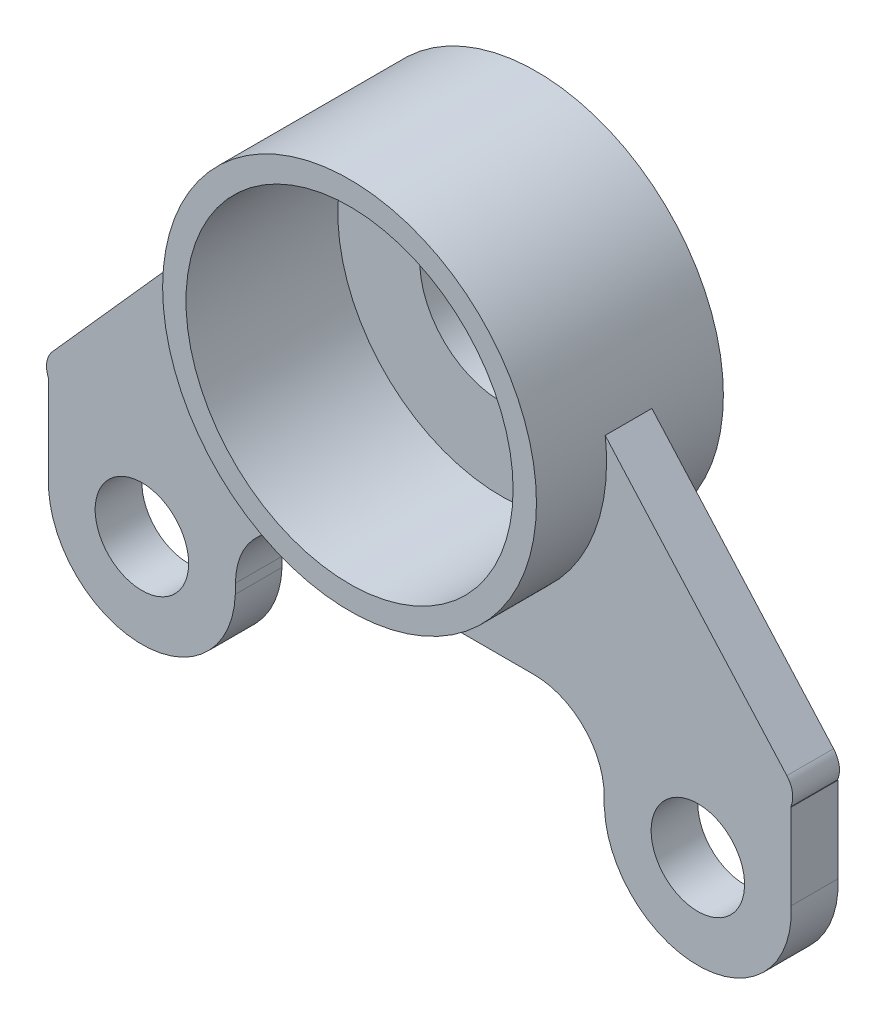
ISO-10303-21;
HEADER;
FILE_DESCRIPTION(('STEP AP214'),'2;1');
FILE_NAME('part.step','',(''),(''),'','','');
FILE_SCHEMA(('AUTOMOTIVE_DESIGN { 1 0 10303 214 1 1 1 1 }'));
ENDSEC;
DATA;
#1=APPLICATION_CONTEXT('core data for automotive mechanical design processes');
#2=APPLICATION_PROTOCOL_DEFINITION('international standard','automotive_design',2000,#1);
#3=PRODUCT_CONTEXT('',#1,'mechanical');
#4=PRODUCT('Part','Part','',(#3));
#5=PRODUCT_RELATED_PRODUCT_CATEGORY('part','',(#4));
#6=PRODUCT_DEFINITION_FORMATION('','',#4);
#7=PRODUCT_DEFINITION_CONTEXT('part definition',#1,'design');
#8=PRODUCT_DEFINITION('design','',#6,#7);
#9=PRODUCT_DEFINITION_SHAPE('','',#8);
#10=(LENGTH_UNIT() NAMED_UNIT(*) SI_UNIT(.MILLI.,.METRE.));
#11=(NAMED_UNIT(*) PLANE_ANGLE_UNIT() SI_UNIT($,.RADIAN.));
#12=(NAMED_UNIT(*) SI_UNIT($,.STERADIAN.) SOLID_ANGLE_UNIT());
#13=UNCERTAINTY_MEASURE_WITH_UNIT(LENGTH_MEASURE(1.E-05),#10,'distance_accuracy_value','');
#14=(GEOMETRIC_REPRESENTATION_CONTEXT(3) GLOBAL_UNCERTAINTY_ASSIGNED_CONTEXT((#13)) GLOBAL_UNIT_ASSIGNED_CONTEXT((#10,
#11,#12)) REPRESENTATION_CONTEXT('',''));
#15=CARTESIAN_POINT('',(0.,0.,0.));
#16=DIRECTION('',(0.,0.,1.));
#17=DIRECTION('',(1.,0.,0.));
#18=AXIS2_PLACEMENT_3D('',#15,#16,#17);
#19=CARTESIAN_POINT('',(41.481618266519,-6.81808244946121,4.));
#20=DIRECTION('',(1.,0.,0.));
#21=DIRECTION('',(0.,0.,-1.));
#22=AXIS2_PLACEMENT_3D('',#19,#20,#21);
#23=PLANE('',#22);
#24=DIRECTION('',(0.,-1.,0.));
#25=VECTOR('',#24,1.);
#26=CARTESIAN_POINT('',(41.481618266519,-6.81808244946121,4.));
#27=LINE('',#26,#25);
#28=CARTESIAN_POINT('',(41.481618266519,1.18191755053879,4.));
#29=VERTEX_POINT('',#28);
#30=CARTESIAN_POINT('',(41.481618266519,-6.13439152434948,4.));
#31=VERTEX_POINT('',#30);
#32=EDGE_CURVE('E200',#29,#31,#27,.T.);
#33=ORIENTED_EDGE('',*,*,#32,.T.);
#34=DIRECTION('',(0.,0.,1.));
#35=VECTOR('',#34,1.);
#36=CARTESIAN_POINT('',(41.481618266519,-6.13439152434948,0.));
#37=LINE('',#36,#35);
#38=CARTESIAN_POINT('',(41.481618266519,-6.13439152434948,0.));
#39=VERTEX_POINT('',#38);
#40=EDGE_CURVE('E195',#31,#39,#37,.F.);
#41=ORIENTED_EDGE('',*,*,#40,.T.);
#42=DIRECTION('',(0.,-1.,0.));
#43=VECTOR('',#42,1.);
#44=CARTESIAN_POINT('',(41.481618266519,-6.81808244946121,0.));
#45=LINE('',#44,#43);
#46=CARTESIAN_POINT('',(41.481618266519,1.18191755053879,0.));
#47=VERTEX_POINT('',#46);
#48=EDGE_CURVE('E199',#47,#39,#45,.T.);
#49=ORIENTED_EDGE('',*,*,#48,.F.);
#50=DIRECTION('',(0.,0.,-1.));
#51=VECTOR('',#50,1.);
#52=CARTESIAN_POINT('',(41.481618266519,1.18191755053879,4.));
#53=LINE('',#52,#51);
#54=EDGE_CURVE('E221',#29,#47,#53,.T.);
#55=ORIENTED_EDGE('',*,*,#54,.F.);
#56=EDGE_LOOP('',(#33,#41,#49,#55));
#57=FACE_BOUND('',#56,.T.);
#58=ADVANCED_FACE('F36',(#57),#23,.T.);
#59=CARTESIAN_POINT('',(25.481618266519,-6.81808244946121,4.));
#60=DIRECTION('',(0.,-1.,0.));
#61=DIRECTION('',(1.,0.,0.));
#62=AXIS2_PLACEMENT_3D('',#59,#60,#61);
#63=PLANE('',#62);
#64=DIRECTION('',(-1.,0.,0.));
#65=VECTOR('',#64,1.);
#66=CARTESIAN_POINT('',(25.481618266519,-6.81808244946121,0.));
#67=LINE('',#66,#65);
#68=CARTESIAN_POINT('',(25.4968850994738,-6.81808244946121,0.));
#69=VERTEX_POINT('',#68);
#70=CARTESIAN_POINT('',(25.481618266519,-6.81808244946121,0.));
#71=VERTEX_POINT('',#70);
#72=EDGE_CURVE('E203',#69,#71,#67,.T.);
#73=ORIENTED_EDGE('',*,*,#72,.F.);
#74=DIRECTION('',(0.,0.,1.));
#75=VECTOR('',#74,1.);
#76=CARTESIAN_POINT('',(25.4968850994738,-6.81808244946121,0.));
#77=LINE('',#76,#75);
#78=CARTESIAN_POINT('',(25.4968850994738,-6.81808244946121,4.));
#79=VERTEX_POINT('',#78);
#80=EDGE_CURVE('E296',#69,#79,#77,.T.);
#81=ORIENTED_EDGE('',*,*,#80,.T.);
#82=DIRECTION('',(-1.,0.,0.));
#83=VECTOR('',#82,1.);
#84=CARTESIAN_POINT('',(25.481618266519,-6.81808244946121,4.));
#85=LINE('',#84,#83);
#86=CARTESIAN_POINT('',(25.481618266519,-6.81808244946121,4.));
#87=VERTEX_POINT('',#86);
#88=EDGE_CURVE('E208',#79,#87,#85,.T.);
#89=ORIENTED_EDGE('',*,*,#88,.T.);
#90=DIRECTION('',(0.,0.,-1.));
#91=VECTOR('',#90,1.);
#92=CARTESIAN_POINT('',(25.481618266519,-6.81808244946121,4.));
#93=LINE('',#92,#91);
#94=EDGE_CURVE('E210',#87,#71,#93,.T.);
#95=ORIENTED_EDGE('',*,*,#94,.T.);
#96=EDGE_LOOP('',(#73,#81,#89,#95));
#97=FACE_BOUND('',#96,.T.);
#98=ADVANCED_FACE('F324',(#97),#63,.T.);
#99=CARTESIAN_POINT('',(-24.718317204901,0.,4.));
#100=DIRECTION('',(0.,1.,0.));
#101=DIRECTION('',(0.,0.,1.));
#102=AXIS2_PLACEMENT_3D('',#99,#100,#101);
#103=PLANE('',#102);
#104=DIRECTION('',(1.,0.,0.));
#105=VECTOR('',#104,1.);
#106=CARTESIAN_POINT('',(-24.718317204901,0.,0.));
#107=LINE('',#106,#105);
#108=CARTESIAN_POINT('',(-0.0816182665190172,0.,0.));
#109=VERTEX_POINT('',#108);
#110=CARTESIAN_POINT('',(19.481618266519,0.,0.));
#111=VERTEX_POINT('',#110);
#112=EDGE_CURVE('E167',#109,#111,#107,.T.);
#113=ORIENTED_EDGE('',*,*,#112,.T.);
#114=DIRECTION('',(0.,0.,1.));
#115=VECTOR('',#114,1.);
#116=CARTESIAN_POINT('',(19.481618266519,0.,4.));
#117=LINE('',#116,#115);
#118=CARTESIAN_POINT('',(19.481618266519,0.,4.));
#119=VERTEX_POINT('',#118);
#120=EDGE_CURVE('E299',#111,#119,#117,.T.);
#121=ORIENTED_EDGE('',*,*,#120,.T.);
#122=DIRECTION('',(1.,0.,0.));
#123=VECTOR('',#122,1.);
#124=CARTESIAN_POINT('',(-24.718317204901,0.,4.));
#125=LINE('',#124,#123);
#126=CARTESIAN_POINT('',(-0.0816182665190172,0.,4.));
#127=VERTEX_POINT('',#126);
#128=EDGE_CURVE('E259',#127,#119,#125,.T.);
#129=ORIENTED_EDGE('',*,*,#128,.F.);
#130=DIRECTION('',(0.,0.,1.));
#131=VECTOR('',#130,1.);
#132=CARTESIAN_POINT('',(-0.081618266519019,0.,0.));
#133=LINE('',#132,#131);
#134=EDGE_CURVE('E288',#127,#109,#133,.F.);
#135=ORIENTED_EDGE('',*,*,#134,.T.);
#136=EDGE_LOOP('',(#113,#121,#129,#135));
#137=FACE_BOUND('',#136,.T.);
#138=ADVANCED_FACE('F314',(#137),#103,.F.);
#139=CARTESIAN_POINT('',(-20.2565864569651,2.,4.));
#140=DIRECTION('',(0.,0.,-1.));
#141=DIRECTION('',(-1.,0.,0.));
#142=AXIS2_PLACEMENT_3D('',#139,#140,#141);
#143=CYLINDRICAL_SURFACE('',#142,2.);
#144=CARTESIAN_POINT('',(-20.2565864569651,2.,0.));
#145=DIRECTION('',(0.,0.,-1.));
#146=DIRECTION('',(-1.,0.,0.));
#147=AXIS2_PLACEMENT_3D('',#144,#145,#146);
#148=CIRCLE('',#147,2.);
#149=CARTESIAN_POINT('',(-22.081618266519,1.18191755053879,0.));
#150=VERTEX_POINT('',#149);
#151=CARTESIAN_POINT('',(-21.7496129500696,3.33074110588354,0.));
#152=VERTEX_POINT('',#151);
#153=EDGE_CURVE('E163',#150,#152,#148,.T.);
#154=ORIENTED_EDGE('',*,*,#153,.F.);
#155=DIRECTION('',(0.,0.,-1.));
#156=VECTOR('',#155,1.);
#157=CARTESIAN_POINT('',(-22.081618266519,1.18191755053879,4.));
#158=LINE('',#157,#156);
#159=CARTESIAN_POINT('',(-22.081618266519,1.18191755053879,4.));
#160=VERTEX_POINT('',#159);
#161=EDGE_CURVE('E247',#160,#150,#158,.T.);
#162=ORIENTED_EDGE('',*,*,#161,.F.);
#163=CARTESIAN_POINT('',(-20.2565864569651,2.,4.));
#164=DIRECTION('',(0.,0.,-1.));
#165=DIRECTION('',(-1.,0.,0.));
#166=AXIS2_PLACEMENT_3D('',#163,#164,#165);
#167=CIRCLE('',#166,2.);
#168=CARTESIAN_POINT('',(-21.7496129500696,3.33074110588354,4.));
#169=VERTEX_POINT('',#168);
#170=EDGE_CURVE('E276',#169,#160,#167,.F.);
#171=ORIENTED_EDGE('',*,*,#170,.F.);
#172=DIRECTION('',(0.,0.,-1.));
#173=VECTOR('',#172,1.);
#174=CARTESIAN_POINT('',(-21.7496129500696,3.33074110588354,4.));
#175=LINE('',#174,#173);
#176=EDGE_CURVE('E272',#152,#169,#175,.F.);
#177=ORIENTED_EDGE('',*,*,#176,.F.);
#178=EDGE_LOOP('',(#154,#162,#171,#177));
#179=FACE_BOUND('',#178,.T.);
#180=ADVANCED_FACE('F352',(#179),#143,.T.);
#181=CARTESIAN_POINT('',(-24.718317204901,0.,4.));
#182=DIRECTION('',(0.746513246552237,-0.665370552941771,0.));
#183=DIRECTION('',(0.665370552941771,0.746513246552237,0.));
#184=AXIS2_PLACEMENT_3D('',#181,#182,#183);
#185=PLANE('',#184);
#186=DIRECTION('',(-0.665370552941771,-0.746513246552237,0.));
#187=VECTOR('',#186,1.);
#188=CARTESIAN_POINT('',(-24.718317204901,0.,4.));
#189=LINE('',#188,#187);
#190=CARTESIAN_POINT('',(-6.19925390133447,20.7774840782016,4.));
#191=VERTEX_POINT('',#190);
#192=EDGE_CURVE('E173',#191,#169,#189,.T.);
#193=ORIENTED_EDGE('',*,*,#192,.F.);
#194=DIRECTION('',(0.,0.,1.));
#195=VECTOR('',#194,1.);
#196=CARTESIAN_POINT('',(-6.19925390133447,20.7774840782016,-6.));
#197=LINE('',#196,#195);
#198=CARTESIAN_POINT('',(-6.19925390133447,20.7774840782016,0.));
#199=VERTEX_POINT('',#198);
#200=EDGE_CURVE('E171',#191,#199,#197,.F.);
#201=ORIENTED_EDGE('',*,*,#200,.T.);
#202=DIRECTION('',(-0.665370552941771,-0.746513246552237,0.));
#203=VECTOR('',#202,1.);
#204=CARTESIAN_POINT('',(-24.718317204901,0.,0.));
#205=LINE('',#204,#203);
#206=EDGE_CURVE('E157',#199,#152,#205,.T.);
#207=ORIENTED_EDGE('',*,*,#206,.T.);
#208=ORIENTED_EDGE('',*,*,#176,.T.);
#209=EDGE_LOOP('',(#193,#201,#207,#208));
#210=FACE_BOUND('',#209,.T.);
#211=ADVANCED_FACE('F172',(#210),#185,.F.);
#212=CARTESIAN_POINT('',(9.68072200830674,38.5940410614726,4.));
#213=DIRECTION('',(-0.746513246552237,-0.665370552941771,0.));
#214=DIRECTION('',(0.665370552941771,-0.746513246552237,0.));
#215=AXIS2_PLACEMENT_3D('',#212,#213,#214);
#216=PLANE('',#215);
#217=DIRECTION('',(-0.665370552941771,0.746513246552237,0.));
#218=VECTOR('',#217,1.);
#219=CARTESIAN_POINT('',(9.68072200830674,38.5940410614726,0.));
#220=LINE('',#219,#218);
#221=CARTESIAN_POINT('',(41.1110569666831,3.33074110588354,0.));
#222=VERTEX_POINT('',#221);
#223=CARTESIAN_POINT('',(25.5606979179479,20.7774840782016,0.));
#224=VERTEX_POINT('',#223);
#225=EDGE_CURVE('E260',#222,#224,#220,.T.);
#226=ORIENTED_EDGE('',*,*,#225,.T.);
#227=DIRECTION('',(0.,0.,1.));
#228=VECTOR('',#227,1.);
#229=CARTESIAN_POINT('',(25.5606979179479,20.7774840782016,-6.));
#230=LINE('',#229,#228);
#231=CARTESIAN_POINT('',(25.5606979179479,20.7774840782016,4.));
#232=VERTEX_POINT('',#231);
#233=EDGE_CURVE('E60',#224,#232,#230,.T.);
#234=ORIENTED_EDGE('',*,*,#233,.T.);
#235=DIRECTION('',(-0.665370552941771,0.746513246552237,0.));
#236=VECTOR('',#235,1.);
#237=CARTESIAN_POINT('',(9.68072200830674,38.5940410614726,4.));
#238=LINE('',#237,#236);
#239=CARTESIAN_POINT('',(41.1110569666831,3.33074110588354,4.));
#240=VERTEX_POINT('',#239);
#241=EDGE_CURVE('E263',#240,#232,#238,.T.);
#242=ORIENTED_EDGE('',*,*,#241,.F.);
#243=DIRECTION('',(0.,0.,-1.));
#244=VECTOR('',#243,1.);
#245=CARTESIAN_POINT('',(41.1110569666831,3.33074110588356,4.));
#246=LINE('',#245,#244);
#247=EDGE_CURVE('E279',#240,#222,#246,.T.);
#248=ORIENTED_EDGE('',*,*,#247,.T.);
#249=EDGE_LOOP('',(#226,#234,#242,#248));
#250=FACE_BOUND('',#249,.T.);
#251=ADVANCED_FACE('F343',(#250),#216,.F.);
#252=CARTESIAN_POINT('',(0.,0.,4.));
#253=DIRECTION('',(0.,0.,-1.));
#254=DIRECTION('',(-1.,0.,0.));
#255=AXIS2_PLACEMENT_3D('',#252,#253,#254);
#256=PLANE('',#255);
#257=CARTESIAN_POINT('',(33.4923385126825,-6.5484072425761,4.));
#258=DIRECTION('',(0.,0.,-1.));
#259=DIRECTION('',(-1.,0.,0.));
#260=AXIS2_PLACEMENT_3D('',#257,#258,#259);
#261=CIRCLE('',#260,4.);
#262=CARTESIAN_POINT('',(29.4923385126825,-6.5484072425761,4.));
#263=VERTEX_POINT('',#262);
#264=EDGE_CURVE('E185',#263,#263,#261,.T.);
#265=ORIENTED_EDGE('',*,*,#264,.T.);
#266=EDGE_LOOP('',(#265));
#267=FACE_BOUND('',#266,.T.);
#268=ORIENTED_EDGE('',*,*,#241,.T.);
#269=CARTESIAN_POINT('',(9.68072200830673,18.8213743907824,4.));
#270=DIRECTION('',(0.,0.,-1.));
#271=DIRECTION('',(-1.,0.,0.));
#272=AXIS2_PLACEMENT_3D('',#269,#270,#271);
#273=CIRCLE('',#272,16.);
#274=EDGE_CURVE('E52',#232,#191,#273,.T.);
#275=ORIENTED_EDGE('',*,*,#274,.T.);
#276=ORIENTED_EDGE('',*,*,#192,.T.);
#277=ORIENTED_EDGE('',*,*,#170,.T.);
#278=DIRECTION('',(0.,-1.,0.));
#279=VECTOR('',#278,1.);
#280=CARTESIAN_POINT('',(-22.081618266519,-6.81808244946121,4.));
#281=LINE('',#280,#279);
#282=CARTESIAN_POINT('',(-22.081618266519,-6.13439152434961,4.));
#283=VERTEX_POINT('',#282);
#284=EDGE_CURVE('E238',#160,#283,#281,.T.);
#285=ORIENTED_EDGE('',*,*,#284,.T.);
#286=CARTESIAN_POINT('',(-14.0923385126825,-6.5484072425761,4.));
#287=DIRECTION('',(0.,0.,1.));
#288=DIRECTION('',(1.,0.,0.));
#289=AXIS2_PLACEMENT_3D('',#286,#287,#288);
#290=CIRCLE('',#289,8.);
#291=CARTESIAN_POINT('',(-6.09688509947379,-6.81808244946121,4.));
#292=VERTEX_POINT('',#291);
#293=EDGE_CURVE('E228',#283,#292,#290,.T.);
#294=ORIENTED_EDGE('',*,*,#293,.T.);
#295=DIRECTION('',(1.,0.,0.));
#296=VECTOR('',#295,1.);
#297=CARTESIAN_POINT('',(-6.08161826651902,-6.81808244946121,4.));
#298=LINE('',#297,#296);
#299=CARTESIAN_POINT('',(-6.08161826651902,-6.81808244946121,4.));
#300=VERTEX_POINT('',#299);
#301=EDGE_CURVE('E241',#292,#300,#298,.T.);
#302=ORIENTED_EDGE('',*,*,#301,.T.);
#303=DIRECTION('',(0.,1.,0.));
#304=VECTOR('',#303,1.);
#305=CARTESIAN_POINT('',(-6.08161826651902,1.18191755053879,4.));
#306=LINE('',#305,#304);
#307=CARTESIAN_POINT('',(-6.08161826651902,-6.,4.));
#308=VERTEX_POINT('',#307);
#309=EDGE_CURVE('E244',#300,#308,#306,.T.);
#310=ORIENTED_EDGE('',*,*,#309,.T.);
#311=CARTESIAN_POINT('',(-0.081618266519019,-6.,4.));
#312=DIRECTION('',(0.,0.,-1.));
#313=DIRECTION('',(-1.,0.,0.));
#314=AXIS2_PLACEMENT_3D('',#311,#312,#313);
#315=CIRCLE('',#314,6.);
#316=EDGE_CURVE('E290',#308,#127,#315,.T.);
#317=ORIENTED_EDGE('',*,*,#316,.T.);
#318=ORIENTED_EDGE('',*,*,#128,.T.);
#319=CARTESIAN_POINT('',(19.481618266519,-6.,4.));
#320=DIRECTION('',(0.,0.,-1.));
#321=DIRECTION('',(-1.,0.,0.));
#322=AXIS2_PLACEMENT_3D('',#319,#320,#321);
#323=CIRCLE('',#322,6.);
#324=CARTESIAN_POINT('',(25.481618266519,-6.,4.));
#325=VERTEX_POINT('',#324);
#326=EDGE_CURVE('E304',#119,#325,#323,.T.);
#327=ORIENTED_EDGE('',*,*,#326,.T.);
#328=DIRECTION('',(0.,1.,0.));
#329=VECTOR('',#328,1.);
#330=CARTESIAN_POINT('',(25.481618266519,1.18191755053879,4.));
#331=LINE('',#330,#329);
#332=EDGE_CURVE('E205',#87,#325,#331,.T.);
#333=ORIENTED_EDGE('',*,*,#332,.F.);
#334=ORIENTED_EDGE('',*,*,#88,.F.);
#335=CARTESIAN_POINT('',(33.4923385126825,-6.5484072425761,4.));
#336=DIRECTION('',(0.,0.,-1.));
#337=DIRECTION('',(-1.,0.,0.));
#338=AXIS2_PLACEMENT_3D('',#335,#336,#337);
#339=CIRCLE('',#338,8.);
#340=EDGE_CURVE('E189',#31,#79,#339,.T.);
#341=ORIENTED_EDGE('',*,*,#340,.F.);
#342=ORIENTED_EDGE('',*,*,#32,.F.);
#343=DIRECTION('',(1.,0.,0.));
#344=VECTOR('',#343,1.);
#345=CARTESIAN_POINT('',(41.481618266519,1.18191755053879,4.));
#346=LINE('',#345,#344);
#347=CARTESIAN_POINT('',(41.4430622831325,1.18191755053879,4.));
#348=VERTEX_POINT('',#347);
#349=EDGE_CURVE('E202',#348,#29,#346,.T.);
#350=ORIENTED_EDGE('',*,*,#349,.F.);
#351=CARTESIAN_POINT('',(39.6180304735786,2.,4.));
#352=DIRECTION('',(0.,0.,-1.));
#353=DIRECTION('',(-1.,0.,0.));
#354=AXIS2_PLACEMENT_3D('',#351,#352,#353);
#355=CIRCLE('',#354,2.);
#356=EDGE_CURVE('E274',#348,#240,#355,.F.);
#357=ORIENTED_EDGE('',*,*,#356,.T.);
#358=EDGE_LOOP('',(#268,#275,#276,#277,#285,#294,#302,#310,#317,#318,#327,#333,#334,#341,#342,
#350,#357));
#359=FACE_BOUND('',#358,.T.);
#360=CARTESIAN_POINT('',(-14.0923385126825,-6.5484072425761,4.));
#361=DIRECTION('',(0.,0.,1.));
#362=DIRECTION('',(1.,0.,0.));
#363=AXIS2_PLACEMENT_3D('',#360,#361,#362);
#364=CIRCLE('',#363,4.);
#365=CARTESIAN_POINT('',(-10.0923385126825,-6.5484072425761,4.));
#366=VERTEX_POINT('',#365);
#367=EDGE_CURVE('E224',#366,#366,#364,.T.);
#368=ORIENTED_EDGE('',*,*,#367,.F.);
#369=EDGE_LOOP('',(#368));
#370=FACE_BOUND('',#369,.T.);
#371=ADVANCED_FACE('F318',(#267,#359,#370),#256,.F.);
#372=CARTESIAN_POINT('',(0.,0.,0.));
#373=DIRECTION('',(0.,0.,-1.));
#374=DIRECTION('',(-1.,0.,0.));
#375=AXIS2_PLACEMENT_3D('',#372,#373,#374);
#376=PLANE('',#375);
#377=CARTESIAN_POINT('',(9.68072200830673,18.8213743907824,0.));
#378=DIRECTION('',(0.,0.,-1.));
#379=DIRECTION('',(-1.,0.,0.));
#380=AXIS2_PLACEMENT_3D('',#377,#378,#379);
#381=CIRCLE('',#380,16.);
#382=EDGE_CURVE('E11',#224,#199,#381,.T.);
#383=ORIENTED_EDGE('',*,*,#382,.F.);
#384=ORIENTED_EDGE('',*,*,#225,.F.);
#385=CARTESIAN_POINT('',(39.6180304735786,2.,0.));
#386=DIRECTION('',(0.,0.,-1.));
#387=DIRECTION('',(-1.,0.,0.));
#388=AXIS2_PLACEMENT_3D('',#385,#386,#387);
#389=CIRCLE('',#388,2.);
#390=CARTESIAN_POINT('',(41.4430622831325,1.18191755053879,0.));
#391=VERTEX_POINT('',#390);
#392=EDGE_CURVE('E264',#222,#391,#389,.T.);
#393=ORIENTED_EDGE('',*,*,#392,.T.);
#394=DIRECTION('',(1.,0.,0.));
#395=VECTOR('',#394,1.);
#396=CARTESIAN_POINT('',(41.481618266519,1.18191755053879,0.));
#397=LINE('',#396,#395);
#398=EDGE_CURVE('E213',#391,#47,#397,.T.);
#399=ORIENTED_EDGE('',*,*,#398,.T.);
#400=ORIENTED_EDGE('',*,*,#48,.T.);
#401=CARTESIAN_POINT('',(33.4923385126825,-6.5484072425761,0.));
#402=DIRECTION('',(0.,0.,-1.));
#403=DIRECTION('',(-1.,0.,0.));
#404=AXIS2_PLACEMENT_3D('',#401,#402,#403);
#405=CIRCLE('',#404,8.);
#406=EDGE_CURVE('E192',#39,#69,#405,.T.);
#407=ORIENTED_EDGE('',*,*,#406,.T.);
#408=ORIENTED_EDGE('',*,*,#72,.T.);
#409=DIRECTION('',(0.,1.,0.));
#410=VECTOR('',#409,1.);
#411=CARTESIAN_POINT('',(25.481618266519,1.18191755053879,0.));
#412=LINE('',#411,#410);
#413=CARTESIAN_POINT('',(25.481618266519,-6.,0.));
#414=VERTEX_POINT('',#413);
#415=EDGE_CURVE('E215',#71,#414,#412,.T.);
#416=ORIENTED_EDGE('',*,*,#415,.T.);
#417=CARTESIAN_POINT('',(19.481618266519,-6.,0.));
#418=DIRECTION('',(0.,0.,-1.));
#419=DIRECTION('',(-1.,0.,0.));
#420=AXIS2_PLACEMENT_3D('',#417,#418,#419);
#421=CIRCLE('',#420,6.);
#422=EDGE_CURVE('E45',#414,#111,#421,.F.);
#423=ORIENTED_EDGE('',*,*,#422,.T.);
#424=ORIENTED_EDGE('',*,*,#112,.F.);
#425=CARTESIAN_POINT('',(-0.081618266519019,-6.,0.));
#426=DIRECTION('',(0.,0.,-1.));
#427=DIRECTION('',(-1.,0.,0.));
#428=AXIS2_PLACEMENT_3D('',#425,#426,#427);
#429=CIRCLE('',#428,6.);
#430=CARTESIAN_POINT('',(-6.08161826651902,-6.,0.));
#431=VERTEX_POINT('',#430);
#432=EDGE_CURVE('E292',#109,#431,#429,.F.);
#433=ORIENTED_EDGE('',*,*,#432,.T.);
#434=DIRECTION('',(0.,1.,0.));
#435=VECTOR('',#434,1.);
#436=CARTESIAN_POINT('',(-6.08161826651902,1.18191755053879,0.));
#437=LINE('',#436,#435);
#438=CARTESIAN_POINT('',(-6.08161826651902,-6.81808244946121,0.));
#439=VERTEX_POINT('',#438);
#440=EDGE_CURVE('E242',#439,#431,#437,.T.);
#441=ORIENTED_EDGE('',*,*,#440,.F.);
#442=DIRECTION('',(1.,0.,0.));
#443=VECTOR('',#442,1.);
#444=CARTESIAN_POINT('',(-6.08161826651902,-6.81808244946121,0.));
#445=LINE('',#444,#443);
#446=CARTESIAN_POINT('',(-6.09688509947379,-6.81808244946121,0.));
#447=VERTEX_POINT('',#446);
#448=EDGE_CURVE('E250',#447,#439,#445,.T.);
#449=ORIENTED_EDGE('',*,*,#448,.F.);
#450=CARTESIAN_POINT('',(-14.0923385126825,-6.5484072425761,0.));
#451=DIRECTION('',(0.,0.,1.));
#452=DIRECTION('',(1.,0.,0.));
#453=AXIS2_PLACEMENT_3D('',#450,#451,#452);
#454=CIRCLE('',#453,8.);
#455=CARTESIAN_POINT('',(-22.081618266519,-6.13439152434961,0.));
#456=VERTEX_POINT('',#455);
#457=EDGE_CURVE('E231',#456,#447,#454,.T.);
#458=ORIENTED_EDGE('',*,*,#457,.F.);
#459=DIRECTION('',(0.,-1.,0.));
#460=VECTOR('',#459,1.);
#461=CARTESIAN_POINT('',(-22.081618266519,-6.81808244946121,0.));
#462=LINE('',#461,#460);
#463=EDGE_CURVE('E237',#150,#456,#462,.T.);
#464=ORIENTED_EDGE('',*,*,#463,.F.);
#465=ORIENTED_EDGE('',*,*,#153,.T.);
#466=ORIENTED_EDGE('',*,*,#206,.F.);
#467=EDGE_LOOP('',(#383,#384,#393,#399,#400,#407,#408,#416,#423,#424,#433,#441,#449,#458,#464,
#465,#466));
#468=FACE_BOUND('',#467,.T.);
#469=CARTESIAN_POINT('',(33.4923385126825,-6.5484072425761,0.));
#470=DIRECTION('',(0.,0.,-1.));
#471=DIRECTION('',(-1.,0.,0.));
#472=AXIS2_PLACEMENT_3D('',#469,#470,#471);
#473=CIRCLE('',#472,4.);
#474=CARTESIAN_POINT('',(29.4923385126825,-6.5484072425761,0.));
#475=VERTEX_POINT('',#474);
#476=EDGE_CURVE('E186',#475,#475,#473,.T.);
#477=ORIENTED_EDGE('',*,*,#476,.F.);
#478=EDGE_LOOP('',(#477));
#479=FACE_BOUND('',#478,.T.);
#480=CARTESIAN_POINT('',(-14.0923385126825,-6.5484072425761,0.));
#481=DIRECTION('',(0.,0.,1.));
#482=DIRECTION('',(1.,0.,0.));
#483=AXIS2_PLACEMENT_3D('',#480,#481,#482);
#484=CIRCLE('',#483,4.);
#485=CARTESIAN_POINT('',(-10.0923385126825,-6.5484072425761,0.));
#486=VERTEX_POINT('',#485);
#487=EDGE_CURVE('E225',#486,#486,#484,.T.);
#488=ORIENTED_EDGE('',*,*,#487,.T.);
#489=EDGE_LOOP('',(#488));
#490=FACE_BOUND('',#489,.T.);
#491=ADVANCED_FACE('F159',(#468,#479,#490),#376,.T.);
#492=CARTESIAN_POINT('',(39.6180304735786,2.,4.));
#493=DIRECTION('',(0.,0.,-1.));
#494=DIRECTION('',(-1.,0.,0.));
#495=AXIS2_PLACEMENT_3D('',#492,#493,#494);
#496=CYLINDRICAL_SURFACE('',#495,2.);
#497=DIRECTION('',(0.,0.,-1.));
#498=VECTOR('',#497,1.);
#499=CARTESIAN_POINT('',(41.4430622831325,1.18191755053879,4.));
#500=LINE('',#499,#498);
#501=EDGE_CURVE('E294',#391,#348,#500,.F.);
#502=ORIENTED_EDGE('',*,*,#501,.F.);
#503=ORIENTED_EDGE('',*,*,#392,.F.);
#504=ORIENTED_EDGE('',*,*,#247,.F.);
#505=ORIENTED_EDGE('',*,*,#356,.F.);
#506=EDGE_LOOP('',(#502,#503,#504,#505));
#507=FACE_BOUND('',#506,.T.);
#508=ADVANCED_FACE('F342',(#507),#496,.T.);
#509=CARTESIAN_POINT('',(-6.08161826651902,1.18191755053879,4.));
#510=DIRECTION('',(-1.,0.,0.));
#511=DIRECTION('',(0.,0.,1.));
#512=AXIS2_PLACEMENT_3D('',#509,#510,#511);
#513=PLANE('',#512);
#514=ORIENTED_EDGE('',*,*,#440,.T.);
#515=DIRECTION('',(0.,0.,1.));
#516=VECTOR('',#515,1.);
#517=CARTESIAN_POINT('',(-6.08161826651902,-6.,4.));
#518=LINE('',#517,#516);
#519=EDGE_CURVE('E285',#431,#308,#518,.T.);
#520=ORIENTED_EDGE('',*,*,#519,.T.);
#521=ORIENTED_EDGE('',*,*,#309,.F.);
#522=DIRECTION('',(0.,0.,-1.));
#523=VECTOR('',#522,1.);
#524=CARTESIAN_POINT('',(-6.08161826651902,-6.81808244946121,4.));
#525=LINE('',#524,#523);
#526=EDGE_CURVE('E168',#300,#439,#525,.T.);
#527=ORIENTED_EDGE('',*,*,#526,.T.);
#528=EDGE_LOOP('',(#514,#520,#521,#527));
#529=FACE_BOUND('',#528,.T.);
#530=ADVANCED_FACE('F375',(#529),#513,.F.);
#531=CARTESIAN_POINT('',(-22.081618266519,-6.81808244946121,4.));
#532=DIRECTION('',(1.,0.,0.));
#533=DIRECTION('',(0.,0.,-1.));
#534=AXIS2_PLACEMENT_3D('',#531,#532,#533);
#535=PLANE('',#534);
#536=ORIENTED_EDGE('',*,*,#463,.T.);
#537=DIRECTION('',(0.,0.,1.));
#538=VECTOR('',#537,1.);
#539=CARTESIAN_POINT('',(-22.081618266519,-6.13439152434961,0.));
#540=LINE('',#539,#538);
#541=EDGE_CURVE('E233',#456,#283,#540,.T.);
#542=ORIENTED_EDGE('',*,*,#541,.T.);
#543=ORIENTED_EDGE('',*,*,#284,.F.);
#544=ORIENTED_EDGE('',*,*,#161,.T.);
#545=EDGE_LOOP('',(#536,#542,#543,#544));
#546=FACE_BOUND('',#545,.T.);
#547=ADVANCED_FACE('F378',(#546),#535,.F.);
#548=CARTESIAN_POINT('',(-6.08161826651902,-6.81808244946121,4.));
#549=DIRECTION('',(0.,1.,0.));
#550=DIRECTION('',(-1.,0.,0.));
#551=AXIS2_PLACEMENT_3D('',#548,#549,#550);
#552=PLANE('',#551);
#553=ORIENTED_EDGE('',*,*,#301,.F.);
#554=DIRECTION('',(0.,0.,1.));
#555=VECTOR('',#554,1.);
#556=CARTESIAN_POINT('',(-6.09688509947379,-6.81808244946121,0.));
#557=LINE('',#556,#555);
#558=EDGE_CURVE('E282',#292,#447,#557,.F.);
#559=ORIENTED_EDGE('',*,*,#558,.T.);
#560=ORIENTED_EDGE('',*,*,#448,.T.);
#561=ORIENTED_EDGE('',*,*,#526,.F.);
#562=EDGE_LOOP('',(#553,#559,#560,#561));
#563=FACE_BOUND('',#562,.T.);
#564=ADVANCED_FACE('F373',(#563),#552,.F.);
#565=CARTESIAN_POINT('',(-14.0923385126825,-6.5484072425761,0.));
#566=DIRECTION('',(0.,0.,1.));
#567=DIRECTION('',(1.,0.,0.));
#568=AXIS2_PLACEMENT_3D('',#565,#566,#567);
#569=CYLINDRICAL_SURFACE('',#568,8.);
#570=ORIENTED_EDGE('',*,*,#541,.F.);
#571=ORIENTED_EDGE('',*,*,#457,.T.);
#572=ORIENTED_EDGE('',*,*,#558,.F.);
#573=ORIENTED_EDGE('',*,*,#293,.F.);
#574=EDGE_LOOP('',(#570,#571,#572,#573));
#575=FACE_BOUND('',#574,.T.);
#576=ADVANCED_FACE('F370',(#575),#569,.T.);
#577=CARTESIAN_POINT('',(-0.081618266519019,-6.,4.));
#578=DIRECTION('',(0.,0.,-1.));
#579=DIRECTION('',(-1.,0.,0.));
#580=AXIS2_PLACEMENT_3D('',#577,#578,#579);
#581=CYLINDRICAL_SURFACE('',#580,6.);
#582=ORIENTED_EDGE('',*,*,#432,.F.);
#583=ORIENTED_EDGE('',*,*,#134,.F.);
#584=ORIENTED_EDGE('',*,*,#316,.F.);
#585=ORIENTED_EDGE('',*,*,#519,.F.);
#586=EDGE_LOOP('',(#582,#583,#584,#585));
#587=FACE_BOUND('',#586,.T.);
#588=ADVANCED_FACE('F368',(#587),#581,.F.);
#589=CARTESIAN_POINT('',(-14.0923385126825,-6.5484072425761,0.));
#590=DIRECTION('',(0.,0.,1.));
#591=DIRECTION('',(1.,0.,0.));
#592=AXIS2_PLACEMENT_3D('',#589,#590,#591);
#593=CYLINDRICAL_SURFACE('',#592,4.);
#594=ORIENTED_EDGE('',*,*,#487,.F.);
#595=EDGE_LOOP('',(#594));
#596=FACE_BOUND('',#595,.T.);
#597=ORIENTED_EDGE('',*,*,#367,.T.);
#598=EDGE_LOOP('',(#597));
#599=FACE_BOUND('',#598,.T.);
#600=ADVANCED_FACE('F365',(#596,#599),#593,.F.);
#601=CARTESIAN_POINT('',(25.481618266519,1.18191755053879,4.));
#602=DIRECTION('',(-1.,0.,0.));
#603=DIRECTION('',(0.,0.,1.));
#604=AXIS2_PLACEMENT_3D('',#601,#602,#603);
#605=PLANE('',#604);
#606=ORIENTED_EDGE('',*,*,#332,.T.);
#607=DIRECTION('',(0.,0.,1.));
#608=VECTOR('',#607,1.);
#609=CARTESIAN_POINT('',(25.481618266519,-6.,4.));
#610=LINE('',#609,#608);
#611=EDGE_CURVE('E302',#325,#414,#610,.F.);
#612=ORIENTED_EDGE('',*,*,#611,.T.);
#613=ORIENTED_EDGE('',*,*,#415,.F.);
#614=ORIENTED_EDGE('',*,*,#94,.F.);
#615=EDGE_LOOP('',(#606,#612,#613,#614));
#616=FACE_BOUND('',#615,.T.);
#617=ADVANCED_FACE('F322',(#616),#605,.T.);
#618=CARTESIAN_POINT('',(41.481618266519,1.18191755053879,4.));
#619=DIRECTION('',(0.,1.,0.));
#620=DIRECTION('',(0.,0.,1.));
#621=AXIS2_PLACEMENT_3D('',#618,#619,#620);
#622=PLANE('',#621);
#623=ORIENTED_EDGE('',*,*,#398,.F.);
#624=ORIENTED_EDGE('',*,*,#501,.T.);
#625=ORIENTED_EDGE('',*,*,#349,.T.);
#626=ORIENTED_EDGE('',*,*,#54,.T.);
#627=EDGE_LOOP('',(#623,#624,#625,#626));
#628=FACE_BOUND('',#627,.T.);
#629=ADVANCED_FACE('F338',(#628),#622,.T.);
#630=CARTESIAN_POINT('',(33.4923385126825,-6.5484072425761,0.));
#631=DIRECTION('',(0.,0.,1.));
#632=DIRECTION('',(1.,0.,0.));
#633=AXIS2_PLACEMENT_3D('',#630,#631,#632);
#634=CYLINDRICAL_SURFACE('',#633,8.);
#635=ORIENTED_EDGE('',*,*,#40,.F.);
#636=ORIENTED_EDGE('',*,*,#340,.T.);
#637=ORIENTED_EDGE('',*,*,#80,.F.);
#638=ORIENTED_EDGE('',*,*,#406,.F.);
#639=EDGE_LOOP('',(#635,#636,#637,#638));
#640=FACE_BOUND('',#639,.T.);
#641=ADVANCED_FACE('F331',(#640),#634,.T.);
#642=CARTESIAN_POINT('',(19.481618266519,-6.,4.));
#643=DIRECTION('',(0.,0.,1.));
#644=DIRECTION('',(1.,0.,0.));
#645=AXIS2_PLACEMENT_3D('',#642,#643,#644);
#646=CYLINDRICAL_SURFACE('',#645,6.);
#647=ORIENTED_EDGE('',*,*,#422,.F.);
#648=ORIENTED_EDGE('',*,*,#611,.F.);
#649=ORIENTED_EDGE('',*,*,#326,.F.);
#650=ORIENTED_EDGE('',*,*,#120,.F.);
#651=EDGE_LOOP('',(#647,#648,#649,#650));
#652=FACE_BOUND('',#651,.T.);
#653=ADVANCED_FACE('F38',(#652),#646,.F.);
#654=CARTESIAN_POINT('',(33.4923385126825,-6.5484072425761,0.));
#655=DIRECTION('',(0.,0.,1.));
#656=DIRECTION('',(1.,0.,0.));
#657=AXIS2_PLACEMENT_3D('',#654,#655,#656);
#658=CYLINDRICAL_SURFACE('',#657,4.);
#659=ORIENTED_EDGE('',*,*,#476,.T.);
#660=EDGE_LOOP('',(#659));
#661=FACE_BOUND('',#660,.T.);
#662=ORIENTED_EDGE('',*,*,#264,.F.);
#663=EDGE_LOOP('',(#662));
#664=FACE_BOUND('',#663,.T.);
#665=ADVANCED_FACE('F524',(#661,#664),#658,.F.);
#666=CARTESIAN_POINT('',(9.68072200830673,18.8213743907824,-6.));
#667=DIRECTION('',(0.,0.,1.));
#668=DIRECTION('',(1.,0.,0.));
#669=AXIS2_PLACEMENT_3D('',#666,#667,#668);
#670=CYLINDRICAL_SURFACE('',#669,16.);
#671=CARTESIAN_POINT('',(9.68072200830673,18.8213743907824,10.));
#672=DIRECTION('',(0.,0.,1.));
#673=DIRECTION('',(1.,0.,0.));
#674=AXIS2_PLACEMENT_3D('',#671,#672,#673);
#675=CIRCLE('',#674,16.);
#676=CARTESIAN_POINT('',(25.6807220083067,18.8213743907824,10.));
#677=VERTEX_POINT('',#676);
#678=EDGE_CURVE('E180',#677,#677,#675,.T.);
#679=ORIENTED_EDGE('',*,*,#678,.F.);
#680=EDGE_LOOP('',(#679));
#681=FACE_BOUND('',#680,.T.);
#682=CARTESIAN_POINT('',(9.68072200830673,18.8213743907824,-6.));
#683=DIRECTION('',(0.,0.,1.));
#684=DIRECTION('',(1.,0.,0.));
#685=AXIS2_PLACEMENT_3D('',#682,#683,#684);
#686=CIRCLE('',#685,16.);
#687=CARTESIAN_POINT('',(25.6807220083067,18.8213743907824,-6.));
#688=VERTEX_POINT('',#687);
#689=EDGE_CURVE('E177',#688,#688,#686,.T.);
#690=ORIENTED_EDGE('',*,*,#689,.T.);
#691=EDGE_LOOP('',(#690));
#692=FACE_BOUND('',#691,.T.);
#693=ORIENTED_EDGE('',*,*,#274,.F.);
#694=ORIENTED_EDGE('',*,*,#233,.F.);
#695=ORIENTED_EDGE('',*,*,#382,.T.);
#696=ORIENTED_EDGE('',*,*,#200,.F.);
#697=EDGE_LOOP('',(#693,#694,#695,#696));
#698=FACE_BOUND('',#697,.T.);
#699=ADVANCED_FACE('F176',(#681,#692,#698),#670,.T.);
#700=CARTESIAN_POINT('',(9.68072200830673,18.8213743907824,-6.));
#701=DIRECTION('',(0.,0.,1.));
#702=DIRECTION('',(1.,0.,0.));
#703=AXIS2_PLACEMENT_3D('',#700,#701,#702);
#704=PLANE('',#703);
#705=CARTESIAN_POINT('',(9.68072200830673,18.8213743907824,-6.));
#706=DIRECTION('',(0.,0.,1.));
#707=DIRECTION('',(1.,0.,0.));
#708=AXIS2_PLACEMENT_3D('',#705,#706,#707);
#709=CIRCLE('',#708,7.);
#710=CARTESIAN_POINT('',(16.6807220083067,18.8213743907824,-6.));
#711=VERTEX_POINT('',#710);
#712=EDGE_CURVE('E40',#711,#711,#709,.T.);
#713=ORIENTED_EDGE('',*,*,#712,.T.);
#714=EDGE_LOOP('',(#713));
#715=FACE_BOUND('',#714,.T.);
#716=ORIENTED_EDGE('',*,*,#689,.F.);
#717=EDGE_LOOP('',(#716));
#718=FACE_BOUND('',#717,.T.);
#719=ADVANCED_FACE('F556',(#715,#718),#704,.F.);
#720=CARTESIAN_POINT('',(9.68072200830673,18.8213743907824,10.));
#721=DIRECTION('',(0.,0.,1.));
#722=DIRECTION('',(1.,0.,0.));
#723=AXIS2_PLACEMENT_3D('',#720,#721,#722);
#724=PLANE('',#723);
#725=CARTESIAN_POINT('',(9.68072200830673,18.8213743907824,10.));
#726=DIRECTION('',(0.,0.,1.));
#727=DIRECTION('',(1.,0.,0.));
#728=AXIS2_PLACEMENT_3D('',#725,#726,#727);
#729=CIRCLE('',#728,14.);
#730=CARTESIAN_POINT('',(23.6807220083067,18.8213743907824,10.));
#731=VERTEX_POINT('',#730);
#732=EDGE_CURVE('E616',#731,#731,#729,.T.);
#733=ORIENTED_EDGE('',*,*,#732,.F.);
#734=EDGE_LOOP('',(#733));
#735=FACE_BOUND('',#734,.T.);
#736=ORIENTED_EDGE('',*,*,#678,.T.);
#737=EDGE_LOOP('',(#736));
#738=FACE_BOUND('',#737,.T.);
#739=ADVANCED_FACE('F564',(#735,#738),#724,.T.);
#740=CARTESIAN_POINT('',(9.68072200830673,18.8213743907824,-3.));
#741=DIRECTION('',(0.,0.,1.));
#742=DIRECTION('',(1.,0.,0.));
#743=AXIS2_PLACEMENT_3D('',#740,#741,#742);
#744=CYLINDRICAL_SURFACE('',#743,14.);
#745=CARTESIAN_POINT('',(9.68072200830673,18.8213743907824,-3.));
#746=DIRECTION('',(0.,0.,1.));
#747=DIRECTION('',(1.,0.,0.));
#748=AXIS2_PLACEMENT_3D('',#745,#746,#747);
#749=CIRCLE('',#748,14.);
#750=CARTESIAN_POINT('',(23.6807220083067,18.8213743907824,-3.));
#751=VERTEX_POINT('',#750);
#752=EDGE_CURVE('E618',#751,#751,#749,.T.);
#753=CARTESIAN_POINT('',(23.6807220083067,18.8213743907824,-3.));
#754=CARTESIAN_POINT('',(23.6807220083067,18.8213743907824,-2.86458333333333));
#755=CARTESIAN_POINT('',(23.6807220083067,18.8213743907824,-2.72916666666667));
#756=CARTESIAN_POINT('',(23.6807220083067,18.8213743907824,-2.45833333333333));
#757=CARTESIAN_POINT('',(23.6807220083067,18.8213743907824,-2.32291666666667));
#758=CARTESIAN_POINT('',(23.6807220083067,18.8213743907824,-2.05208333333333));
#759=CARTESIAN_POINT('',(23.6807220083067,18.8213743907824,-1.91666666666667));
#760=CARTESIAN_POINT('',(23.6807220083067,18.8213743907824,-1.64583333333333));
#761=CARTESIAN_POINT('',(23.6807220083067,18.8213743907824,-1.51041666666667));
#762=CARTESIAN_POINT('',(23.6807220083067,18.8213743907824,-1.23958333333333));
#763=CARTESIAN_POINT('',(23.6807220083067,18.8213743907824,-1.10416666666667));
#764=CARTESIAN_POINT('',(23.6807220083067,18.8213743907824,-0.833333333333333));
#765=CARTESIAN_POINT('',(23.6807220083067,18.8213743907824,-0.697916666666666));
#766=CARTESIAN_POINT('',(23.6807220083067,18.8213743907824,-0.427083333333333));
#767=CARTESIAN_POINT('',(23.6807220083067,18.8213743907824,-0.291666666666666));
#768=CARTESIAN_POINT('',(23.6807220083067,18.8213743907824,-0.0208333333333331));
#769=CARTESIAN_POINT('',(23.6807220083067,18.8213743907824,0.114583333333334));
#770=CARTESIAN_POINT('',(23.6807220083067,18.8213743907824,0.385416666666667));
#771=CARTESIAN_POINT('',(23.6807220083067,18.8213743907824,0.520833333333334));
#772=CARTESIAN_POINT('',(23.6807220083067,18.8213743907824,0.791666666666667));
#773=CARTESIAN_POINT('',(23.6807220083067,18.8213743907824,0.927083333333333));
#774=CARTESIAN_POINT('',(23.6807220083067,18.8213743907824,1.19791666666667));
#775=CARTESIAN_POINT('',(23.6807220083067,18.8213743907824,1.33333333333333));
#776=CARTESIAN_POINT('',(23.6807220083067,18.8213743907824,1.60416666666667));
#777=CARTESIAN_POINT('',(23.6807220083067,18.8213743907824,1.73958333333333));
#778=CARTESIAN_POINT('',(23.6807220083067,18.8213743907824,2.01041666666667));
#779=CARTESIAN_POINT('',(23.6807220083067,18.8213743907824,2.14583333333333));
#780=CARTESIAN_POINT('',(23.6807220083067,18.8213743907824,2.41666666666667));
#781=CARTESIAN_POINT('',(23.6807220083067,18.8213743907824,2.55208333333333));
#782=CARTESIAN_POINT('',(23.6807220083067,18.8213743907824,2.82291666666667));
#783=CARTESIAN_POINT('',(23.6807220083067,18.8213743907824,2.95833333333333));
#784=CARTESIAN_POINT('',(23.6807220083067,18.8213743907824,3.22916666666667));
#785=CARTESIAN_POINT('',(23.6807220083067,18.8213743907824,3.36458333333333));
#786=CARTESIAN_POINT('',(23.6807220083067,18.8213743907824,3.63541666666667));
#787=CARTESIAN_POINT('',(23.6807220083067,18.8213743907824,3.77083333333333));
#788=CARTESIAN_POINT('',(23.6807220083067,18.8213743907824,4.04166666666667));
#789=CARTESIAN_POINT('',(23.6807220083067,18.8213743907824,4.17708333333333));
#790=CARTESIAN_POINT('',(23.6807220083067,18.8213743907824,4.44791666666667));
#791=CARTESIAN_POINT('',(23.6807220083067,18.8213743907824,4.58333333333333));
#792=CARTESIAN_POINT('',(23.6807220083067,18.8213743907824,4.85416666666667));
#793=CARTESIAN_POINT('',(23.6807220083067,18.8213743907824,4.98958333333333));
#794=CARTESIAN_POINT('',(23.6807220083067,18.8213743907824,5.26041666666667));
#795=CARTESIAN_POINT('',(23.6807220083067,18.8213743907824,5.39583333333333));
#796=CARTESIAN_POINT('',(23.6807220083067,18.8213743907824,5.66666666666667));
#797=CARTESIAN_POINT('',(23.6807220083067,18.8213743907824,5.80208333333333));
#798=CARTESIAN_POINT('',(23.6807220083067,18.8213743907824,6.07291666666667));
#799=CARTESIAN_POINT('',(23.6807220083067,18.8213743907824,6.20833333333333));
#800=CARTESIAN_POINT('',(23.6807220083067,18.8213743907824,6.47916666666667));
#801=CARTESIAN_POINT('',(23.6807220083067,18.8213743907824,6.61458333333333));
#802=CARTESIAN_POINT('',(23.6807220083067,18.8213743907824,6.88541666666667));
#803=CARTESIAN_POINT('',(23.6807220083067,18.8213743907824,7.02083333333333));
#804=CARTESIAN_POINT('',(23.6807220083067,18.8213743907824,7.29166666666667));
#805=CARTESIAN_POINT('',(23.6807220083067,18.8213743907824,7.42708333333333));
#806=CARTESIAN_POINT('',(23.6807220083067,18.8213743907824,7.69791666666667));
#807=CARTESIAN_POINT('',(23.6807220083067,18.8213743907824,7.83333333333333));
#808=CARTESIAN_POINT('',(23.6807220083067,18.8213743907824,8.10416666666667));
#809=CARTESIAN_POINT('',(23.6807220083067,18.8213743907824,8.23958333333333));
#810=CARTESIAN_POINT('',(23.6807220083067,18.8213743907824,8.51041666666667));
#811=CARTESIAN_POINT('',(23.6807220083067,18.8213743907824,8.64583333333333));
#812=CARTESIAN_POINT('',(23.6807220083067,18.8213743907824,8.91666666666667));
#813=CARTESIAN_POINT('',(23.6807220083067,18.8213743907824,9.05208333333333));
#814=CARTESIAN_POINT('',(23.6807220083067,18.8213743907824,9.32291666666667));
#815=CARTESIAN_POINT('',(23.6807220083067,18.8213743907824,9.45833333333333));
#816=CARTESIAN_POINT('',(23.6807220083067,18.8213743907824,9.72916666666667));
#817=CARTESIAN_POINT('',(23.6807220083067,18.8213743907824,9.86458333333333));
#818=CARTESIAN_POINT('',(23.6807220083067,18.8213743907824,10.));
#819=B_SPLINE_CURVE_WITH_KNOTS('',3,(#753,#754,#755,#756,#757,#758,#759,#760,#761,#762,#763,
#764,#765,#766,#767,#768,#769,#770,#771,#772,#773,#774,#775,#776,#777,#778,#779,#780,#781,#782,
#783,#784,#785,#786,#787,#788,#789,#790,#791,#792,#793,#794,#795,#796,#797,#798,#799,#800,#801,
#802,#803,#804,#805,#806,#807,#808,#809,#810,#811,#812,#813,#814,#815,#816,#817,#818),
.UNSPECIFIED.,.F.,.F.,(4,2,2,2,2,2,2,2,2,2,2,2,2,2,2,2,2,2,2,2,2,2,2,2,2,2,2,2,2,2,2,2,4),(0.,
0.40625,0.8125,1.21875,1.625,2.03125,2.4375,2.84375,3.25,3.65625,4.0625,4.46875,4.875,5.28125,
5.6875,6.09375,6.5,6.90625,7.3125,7.71875,8.125,8.53125,8.9375,9.34375,9.75,10.15625,10.5625,
10.96875,11.375,11.78125,12.1875,12.59375,13.),.UNSPECIFIED.);
#820=EDGE_CURVE('BSEAM569',#751,#731,#819,.T.);
#821=ORIENTED_EDGE('',*,*,#752,.F.);
#822=ORIENTED_EDGE('',*,*,#732,.T.);
#823=ORIENTED_EDGE('',*,*,#820,.T.);
#824=ORIENTED_EDGE('',*,*,#820,.F.);
#825=EDGE_LOOP('',(#821,#823,#822,#824));
#826=FACE_BOUND('',#825,.T.);
#827=ADVANCED_FACE('F569',(#826),#744,.F.);
#828=CARTESIAN_POINT('',(9.68072200830673,18.8213743907824,-3.));
#829=DIRECTION('',(0.,0.,1.));
#830=DIRECTION('',(1.,0.,0.));
#831=AXIS2_PLACEMENT_3D('',#828,#829,#830);
#832=PLANE('',#831);
#833=CARTESIAN_POINT('',(9.68072200830673,18.8213743907824,-3.));
#834=DIRECTION('',(0.,0.,1.));
#835=DIRECTION('',(1.,0.,0.));
#836=AXIS2_PLACEMENT_3D('',#833,#834,#835);
#837=CIRCLE('',#836,7.);
#838=CARTESIAN_POINT('',(16.6807220083067,18.8213743907824,-3.));
#839=VERTEX_POINT('',#838);
#840=EDGE_CURVE('E613',#839,#839,#837,.T.);
#841=ORIENTED_EDGE('',*,*,#840,.F.);
#842=EDGE_LOOP('',(#841));
#843=FACE_BOUND('',#842,.T.);
#844=ORIENTED_EDGE('',*,*,#752,.T.);
#845=EDGE_LOOP('',(#844));
#846=FACE_BOUND('',#845,.T.);
#847=ADVANCED_FACE('F579',(#843,#846),#832,.T.);
#848=CARTESIAN_POINT('',(9.68072200830673,18.8213743907824,-16.));
#849=DIRECTION('',(0.,0.,1.));
#850=DIRECTION('',(1.,0.,0.));
#851=AXIS2_PLACEMENT_3D('',#848,#849,#850);
#852=CYLINDRICAL_SURFACE('',#851,7.);
#853=CARTESIAN_POINT('',(16.6807220083067,18.8213743907824,-3.));
#854=CARTESIAN_POINT('',(16.6807220083067,18.8213743907824,-3.03125));
#855=CARTESIAN_POINT('',(16.6807220083067,18.8213743907824,-3.0625));
#856=CARTESIAN_POINT('',(16.6807220083067,18.8213743907824,-3.125));
#857=CARTESIAN_POINT('',(16.6807220083067,18.8213743907824,-3.15625));
#858=CARTESIAN_POINT('',(16.6807220083067,18.8213743907824,-3.21875));
#859=CARTESIAN_POINT('',(16.6807220083067,18.8213743907824,-3.25));
#860=CARTESIAN_POINT('',(16.6807220083067,18.8213743907824,-3.3125));
#861=CARTESIAN_POINT('',(16.6807220083067,18.8213743907824,-3.34375));
#862=CARTESIAN_POINT('',(16.6807220083067,18.8213743907824,-3.40625));
#863=CARTESIAN_POINT('',(16.6807220083067,18.8213743907824,-3.4375));
#864=CARTESIAN_POINT('',(16.6807220083067,18.8213743907824,-3.5));
#865=CARTESIAN_POINT('',(16.6807220083067,18.8213743907824,-3.53125));
#866=CARTESIAN_POINT('',(16.6807220083067,18.8213743907824,-3.59375));
#867=CARTESIAN_POINT('',(16.6807220083067,18.8213743907824,-3.625));
#868=CARTESIAN_POINT('',(16.6807220083067,18.8213743907824,-3.6875));
#869=CARTESIAN_POINT('',(16.6807220083067,18.8213743907824,-3.71875));
#870=CARTESIAN_POINT('',(16.6807220083067,18.8213743907824,-3.78125));
#871=CARTESIAN_POINT('',(16.6807220083067,18.8213743907824,-3.8125));
#872=CARTESIAN_POINT('',(16.6807220083067,18.8213743907824,-3.875));
#873=CARTESIAN_POINT('',(16.6807220083067,18.8213743907824,-3.90625));
#874=CARTESIAN_POINT('',(16.6807220083067,18.8213743907824,-3.96875));
#875=CARTESIAN_POINT('',(16.6807220083067,18.8213743907824,-4.));
#876=CARTESIAN_POINT('',(16.6807220083067,18.8213743907824,-4.0625));
#877=CARTESIAN_POINT('',(16.6807220083067,18.8213743907824,-4.09375));
#878=CARTESIAN_POINT('',(16.6807220083067,18.8213743907824,-4.15625));
#879=CARTESIAN_POINT('',(16.6807220083067,18.8213743907824,-4.1875));
#880=CARTESIAN_POINT('',(16.6807220083067,18.8213743907824,-4.25));
#881=CARTESIAN_POINT('',(16.6807220083067,18.8213743907824,-4.28125));
#882=CARTESIAN_POINT('',(16.6807220083067,18.8213743907824,-4.34375));
#883=CARTESIAN_POINT('',(16.6807220083067,18.8213743907824,-4.375));
#884=CARTESIAN_POINT('',(16.6807220083067,18.8213743907824,-4.4375));
#885=CARTESIAN_POINT('',(16.6807220083067,18.8213743907824,-4.46875));
#886=CARTESIAN_POINT('',(16.6807220083067,18.8213743907824,-4.53125));
#887=CARTESIAN_POINT('',(16.6807220083067,18.8213743907824,-4.5625));
#888=CARTESIAN_POINT('',(16.6807220083067,18.8213743907824,-4.625));
#889=CARTESIAN_POINT('',(16.6807220083067,18.8213743907824,-4.65625));
#890=CARTESIAN_POINT('',(16.6807220083067,18.8213743907824,-4.71875));
#891=CARTESIAN_POINT('',(16.6807220083067,18.8213743907824,-4.75));
#892=CARTESIAN_POINT('',(16.6807220083067,18.8213743907824,-4.8125));
#893=CARTESIAN_POINT('',(16.6807220083067,18.8213743907824,-4.84375));
#894=CARTESIAN_POINT('',(16.6807220083067,18.8213743907824,-4.90625));
#895=CARTESIAN_POINT('',(16.6807220083067,18.8213743907824,-4.9375));
#896=CARTESIAN_POINT('',(16.6807220083067,18.8213743907824,-5.));
#897=CARTESIAN_POINT('',(16.6807220083067,18.8213743907824,-5.03125));
#898=CARTESIAN_POINT('',(16.6807220083067,18.8213743907824,-5.09375));
#899=CARTESIAN_POINT('',(16.6807220083067,18.8213743907824,-5.125));
#900=CARTESIAN_POINT('',(16.6807220083067,18.8213743907824,-5.1875));
#901=CARTESIAN_POINT('',(16.6807220083067,18.8213743907824,-5.21875));
#902=CARTESIAN_POINT('',(16.6807220083067,18.8213743907824,-5.28125));
#903=CARTESIAN_POINT('',(16.6807220083067,18.8213743907824,-5.3125));
#904=CARTESIAN_POINT('',(16.6807220083067,18.8213743907824,-5.375));
#905=CARTESIAN_POINT('',(16.6807220083067,18.8213743907824,-5.40625));
#906=CARTESIAN_POINT('',(16.6807220083067,18.8213743907824,-5.46875));
#907=CARTESIAN_POINT('',(16.6807220083067,18.8213743907824,-5.5));
#908=CARTESIAN_POINT('',(16.6807220083067,18.8213743907824,-5.5625));
#909=CARTESIAN_POINT('',(16.6807220083067,18.8213743907824,-5.59375));
#910=CARTESIAN_POINT('',(16.6807220083067,18.8213743907824,-5.65625));
#911=CARTESIAN_POINT('',(16.6807220083067,18.8213743907824,-5.6875));
#912=CARTESIAN_POINT('',(16.6807220083067,18.8213743907824,-5.75));
#913=CARTESIAN_POINT('',(16.6807220083067,18.8213743907824,-5.78125));
#914=CARTESIAN_POINT('',(16.6807220083067,18.8213743907824,-5.84375));
#915=CARTESIAN_POINT('',(16.6807220083067,18.8213743907824,-5.875));
#916=CARTESIAN_POINT('',(16.6807220083067,18.8213743907824,-5.9375));
#917=CARTESIAN_POINT('',(16.6807220083067,18.8213743907824,-5.96875));
#918=CARTESIAN_POINT('',(16.6807220083067,18.8213743907824,-6.));
#919=B_SPLINE_CURVE_WITH_KNOTS('',3,(#853,#854,#855,#856,#857,#858,#859,#860,#861,#862,#863,
#864,#865,#866,#867,#868,#869,#870,#871,#872,#873,#874,#875,#876,#877,#878,#879,#880,#881,#882,
#883,#884,#885,#886,#887,#888,#889,#890,#891,#892,#893,#894,#895,#896,#897,#898,#899,#900,#901,
#902,#903,#904,#905,#906,#907,#908,#909,#910,#911,#912,#913,#914,#915,#916,#917,#918),
.UNSPECIFIED.,.F.,.F.,(4,2,2,2,2,2,2,2,2,2,2,2,2,2,2,2,2,2,2,2,2,2,2,2,2,2,2,2,2,2,2,2,4),(0.,
0.0937500000000001,0.1875,0.28125,0.375,0.46875,0.5625,0.656250000000001,0.750000000000001,
0.843749999999999,0.937499999999999,1.03125,1.125,1.21875,1.3125,1.40625,1.5,1.59375,1.6875,
1.78125,1.875,1.96875,2.0625,2.15625,2.25,2.34375,2.4375,2.53125,2.625,2.71875,2.8125,2.90625,
3.),.UNSPECIFIED.);
#920=EDGE_CURVE('BSEAM596',#839,#711,#919,.T.);
#921=ORIENTED_EDGE('',*,*,#840,.T.);
#922=ORIENTED_EDGE('',*,*,#712,.F.);
#923=ORIENTED_EDGE('',*,*,#920,.T.);
#924=ORIENTED_EDGE('',*,*,#920,.F.);
#925=EDGE_LOOP('',(#921,#923,#922,#924));
#926=FACE_BOUND('',#925,.T.);
#927=ADVANCED_FACE('F596',(#926),#852,.F.);
#928=CLOSED_SHELL('',(#58,#98,#138,#180,#211,#251,#371,#491,#508,#530,#547,#564,#576,#588,#600,
#617,#629,#641,#653,#665,#699,#719,#739,#827,#847,#927));
#929=MANIFOLD_SOLID_BREP('B2',#928);
#930=ADVANCED_BREP_SHAPE_REPRESENTATION('',(#18,#929),#14);
#931=SHAPE_DEFINITION_REPRESENTATION(#9,#930);
ENDSEC;
END-ISO-10303-21;
